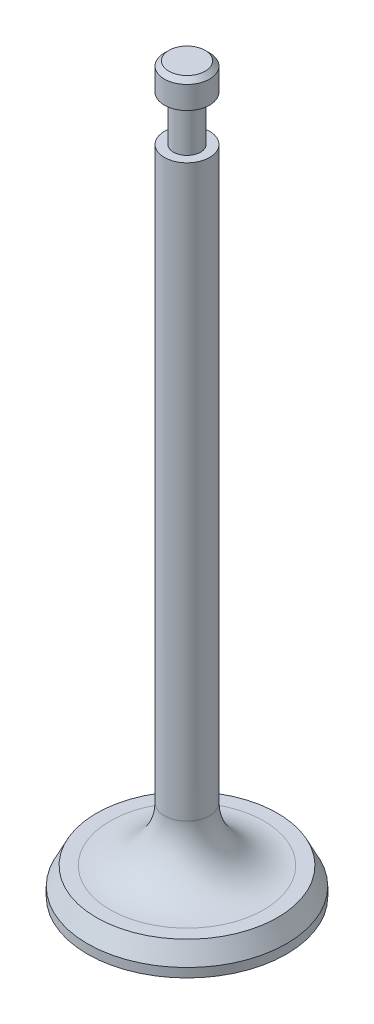
ISO-10303-21;
HEADER;
FILE_DESCRIPTION(('STEP AP214'),'2;1');
FILE_NAME('part.step','',(''),(''),'','','');
FILE_SCHEMA(('AUTOMOTIVE_DESIGN { 1 0 10303 214 1 1 1 1 }'));
ENDSEC;
DATA;
#1=APPLICATION_CONTEXT('core data for automotive mechanical design processes');
#2=APPLICATION_PROTOCOL_DEFINITION('international standard','automotive_design',2000,#1);
#3=PRODUCT_CONTEXT('',#1,'mechanical');
#4=PRODUCT('Part','Part','',(#3));
#5=PRODUCT_RELATED_PRODUCT_CATEGORY('part','',(#4));
#6=PRODUCT_DEFINITION_FORMATION('','',#4);
#7=PRODUCT_DEFINITION_CONTEXT('part definition',#1,'design');
#8=PRODUCT_DEFINITION('design','',#6,#7);
#9=PRODUCT_DEFINITION_SHAPE('','',#8);
#10=(LENGTH_UNIT() NAMED_UNIT(*) SI_UNIT(.MILLI.,.METRE.));
#11=(NAMED_UNIT(*) PLANE_ANGLE_UNIT() SI_UNIT($,.RADIAN.));
#12=(NAMED_UNIT(*) SI_UNIT($,.STERADIAN.) SOLID_ANGLE_UNIT());
#13=UNCERTAINTY_MEASURE_WITH_UNIT(LENGTH_MEASURE(1.E-05),#10,'distance_accuracy_value','');
#14=(GEOMETRIC_REPRESENTATION_CONTEXT(3) GLOBAL_UNCERTAINTY_ASSIGNED_CONTEXT((#13)) GLOBAL_UNIT_ASSIGNED_CONTEXT((#10,
#11,#12)) REPRESENTATION_CONTEXT('',''));
#15=CARTESIAN_POINT('',(0.,0.,0.));
#16=DIRECTION('',(0.,0.,1.));
#17=DIRECTION('',(1.,0.,0.));
#18=AXIS2_PLACEMENT_3D('',#15,#16,#17);
#19=CARTESIAN_POINT('',(0.,0.,-2.50000000000002));
#20=DIRECTION('',(0.,1.,0.));
#21=DIRECTION('',(0.,0.,1.));
#22=AXIS2_PLACEMENT_3D('',#19,#20,#21);
#23=PLANE('',#22);
#24=CARTESIAN_POINT('',(0.,0.,0.));
#25=DIRECTION('',(0.,1.,0.));
#26=DIRECTION('',(0.,0.,1.));
#27=AXIS2_PLACEMENT_3D('',#24,#25,#26);
#28=CIRCLE('',#27,2.00000000000002);
#29=CARTESIAN_POINT('',(0.,0.,2.00000000000002));
#30=VERTEX_POINT('',#29);
#31=EDGE_CURVE('E10',#30,#30,#28,.T.);
#32=ORIENTED_EDGE('',*,*,#31,.T.);
#33=EDGE_LOOP('',(#32));
#34=FACE_BOUND('',#33,.T.);
#35=ADVANCED_FACE('F44',(#34),#23,.T.);
#36=CARTESIAN_POINT('',(0.,-80.,0.));
#37=DIRECTION('',(0.,-1.,0.));
#38=DIRECTION('',(0.,0.,-1.));
#39=AXIS2_PLACEMENT_3D('',#36,#37,#38);
#40=PLANE('',#39);
#41=CARTESIAN_POINT('',(0.,-80.,0.));
#42=DIRECTION('',(0.,-1.,0.));
#43=DIRECTION('',(0.,0.,-1.));
#44=AXIS2_PLACEMENT_3D('',#41,#42,#43);
#45=CIRCLE('',#44,11.);
#46=CARTESIAN_POINT('',(0.,-80.,-11.));
#47=VERTEX_POINT('',#46);
#48=EDGE_CURVE('E81',#47,#47,#45,.T.);
#49=ORIENTED_EDGE('',*,*,#48,.T.);
#50=EDGE_LOOP('',(#49));
#51=FACE_BOUND('',#50,.T.);
#52=ADVANCED_FACE('F121',(#51),#40,.T.);
#53=CARTESIAN_POINT('',(0.,0.,0.));
#54=DIRECTION('',(0.,-1.,0.));
#55=DIRECTION('',(0.,0.,-1.));
#56=AXIS2_PLACEMENT_3D('',#53,#54,#55);
#57=CYLINDRICAL_SURFACE('',#56,11.);
#58=CARTESIAN_POINT('',(0.,-79.,0.));
#59=DIRECTION('',(0.,1.,0.));
#60=DIRECTION('',(0.,0.,1.));
#61=AXIS2_PLACEMENT_3D('',#58,#59,#60);
#62=CIRCLE('',#61,11.);
#63=CARTESIAN_POINT('',(0.,-79.,11.));
#64=VERTEX_POINT('',#63);
#65=EDGE_CURVE('E67',#64,#64,#62,.F.);
#66=ORIENTED_EDGE('',*,*,#65,.T.);
#67=EDGE_LOOP('',(#66));
#68=FACE_BOUND('',#67,.T.);
#69=ORIENTED_EDGE('',*,*,#48,.F.);
#70=EDGE_LOOP('',(#69));
#71=FACE_BOUND('',#70,.T.);
#72=ADVANCED_FACE('F126',(#68,#71),#57,.T.);
#73=CARTESIAN_POINT('',(0.,-77.,-11.));
#74=DIRECTION('',(0.,1.,0.));
#75=DIRECTION('',(0.,0.,1.));
#76=AXIS2_PLACEMENT_3D('',#73,#74,#75);
#77=PLANE('',#76);
#78=CARTESIAN_POINT('',(0.,-77.,0.));
#79=DIRECTION('',(0.,1.,0.));
#80=DIRECTION('',(0.,0.,1.));
#81=AXIS2_PLACEMENT_3D('',#78,#79,#80);
#82=CIRCLE('',#81,10.);
#83=CARTESIAN_POINT('',(0.,-77.,10.));
#84=VERTEX_POINT('',#83);
#85=EDGE_CURVE('E60',#84,#84,#82,.T.);
#86=ORIENTED_EDGE('',*,*,#85,.T.);
#87=EDGE_LOOP('',(#86));
#88=FACE_BOUND('',#87,.T.);
#89=CARTESIAN_POINT('',(0.,-77.,0.));
#90=DIRECTION('',(0.,1.,0.));
#91=DIRECTION('',(0.,0.,1.));
#92=AXIS2_PLACEMENT_3D('',#89,#90,#91);
#93=CIRCLE('',#92,8.50000000000001);
#94=CARTESIAN_POINT('',(0.,-77.,8.50000000000001));
#95=VERTEX_POINT('',#94);
#96=EDGE_CURVE('E77',#95,#95,#93,.F.);
#97=ORIENTED_EDGE('',*,*,#96,.T.);
#98=EDGE_LOOP('',(#97));
#99=FACE_BOUND('',#98,.T.);
#100=ADVANCED_FACE('F145',(#88,#99),#77,.T.);
#101=CARTESIAN_POINT('',(0.,0.,0.));
#102=DIRECTION('',(0.,-1.,0.));
#103=DIRECTION('',(0.,0.,-1.));
#104=AXIS2_PLACEMENT_3D('',#101,#102,#103);
#105=CYLINDRICAL_SURFACE('',#104,2.50000000000001);
#106=CARTESIAN_POINT('',(0.,-71.,0.));
#107=DIRECTION('',(0.,1.,0.));
#108=DIRECTION('',(0.,0.,1.));
#109=AXIS2_PLACEMENT_3D('',#106,#107,#108);
#110=CIRCLE('',#109,2.50000000000001);
#111=CARTESIAN_POINT('',(0.,-71.,2.50000000000001));
#112=VERTEX_POINT('',#111);
#113=EDGE_CURVE('E73',#112,#112,#110,.T.);
#114=ORIENTED_EDGE('',*,*,#113,.T.);
#115=EDGE_LOOP('',(#114));
#116=FACE_BOUND('',#115,.T.);
#117=CARTESIAN_POINT('',(0.,-8.,0.));
#118=DIRECTION('',(0.,-1.,0.));
#119=DIRECTION('',(0.,0.,-1.));
#120=AXIS2_PLACEMENT_3D('',#117,#118,#119);
#121=CIRCLE('',#120,2.50000000000001);
#122=CARTESIAN_POINT('',(0.,-8.,-2.50000000000001));
#123=VERTEX_POINT('',#122);
#124=EDGE_CURVE('E85',#123,#123,#121,.T.);
#125=ORIENTED_EDGE('',*,*,#124,.T.);
#126=EDGE_LOOP('',(#125));
#127=FACE_BOUND('',#126,.T.);
#128=ADVANCED_FACE('F150',(#116,#127),#105,.T.);
#129=CARTESIAN_POINT('',(0.,-8.,-2.50000000000001));
#130=DIRECTION('',(0.,1.,0.));
#131=DIRECTION('',(0.,0.,1.));
#132=AXIS2_PLACEMENT_3D('',#129,#130,#131);
#133=PLANE('',#132);
#134=CARTESIAN_POINT('',(0.,-8.,0.));
#135=DIRECTION('',(0.,-1.,0.));
#136=DIRECTION('',(0.,0.,-1.));
#137=AXIS2_PLACEMENT_3D('',#134,#135,#136);
#138=CIRCLE('',#137,1.50000000000002);
#139=CARTESIAN_POINT('',(0.,-8.,-1.50000000000002));
#140=VERTEX_POINT('',#139);
#141=EDGE_CURVE('E89',#140,#140,#138,.T.);
#142=ORIENTED_EDGE('',*,*,#141,.T.);
#143=EDGE_LOOP('',(#142));
#144=FACE_BOUND('',#143,.T.);
#145=ORIENTED_EDGE('',*,*,#124,.F.);
#146=EDGE_LOOP('',(#145));
#147=FACE_BOUND('',#146,.T.);
#148=ADVANCED_FACE('F156',(#144,#147),#133,.T.);
#149=CARTESIAN_POINT('',(0.,0.,0.));
#150=DIRECTION('',(0.,-1.,0.));
#151=DIRECTION('',(0.,0.,-1.));
#152=AXIS2_PLACEMENT_3D('',#149,#150,#151);
#153=CYLINDRICAL_SURFACE('',#152,1.50000000000002);
#154=CARTESIAN_POINT('',(0.,-3.,0.));
#155=DIRECTION('',(0.,-1.,0.));
#156=DIRECTION('',(0.,0.,-1.));
#157=AXIS2_PLACEMENT_3D('',#154,#155,#156);
#158=CIRCLE('',#157,1.50000000000002);
#159=CARTESIAN_POINT('',(0.,-3.,-1.50000000000002));
#160=VERTEX_POINT('',#159);
#161=EDGE_CURVE('E93',#160,#160,#158,.T.);
#162=ORIENTED_EDGE('',*,*,#161,.T.);
#163=EDGE_LOOP('',(#162));
#164=FACE_BOUND('',#163,.T.);
#165=ORIENTED_EDGE('',*,*,#141,.F.);
#166=EDGE_LOOP('',(#165));
#167=FACE_BOUND('',#166,.T.);
#168=ADVANCED_FACE('F118',(#164,#167),#153,.T.);
#169=CARTESIAN_POINT('',(0.,-3.,-1.50000000000002));
#170=DIRECTION('',(0.,-1.,0.));
#171=DIRECTION('',(0.,0.,-1.));
#172=AXIS2_PLACEMENT_3D('',#169,#170,#171);
#173=PLANE('',#172);
#174=CARTESIAN_POINT('',(0.,-3.,0.));
#175=DIRECTION('',(0.,-1.,0.));
#176=DIRECTION('',(0.,0.,-1.));
#177=AXIS2_PLACEMENT_3D('',#174,#175,#176);
#178=CIRCLE('',#177,2.50000000000002);
#179=CARTESIAN_POINT('',(0.,-3.,-2.50000000000002));
#180=VERTEX_POINT('',#179);
#181=EDGE_CURVE('E97',#180,#180,#178,.T.);
#182=ORIENTED_EDGE('',*,*,#181,.T.);
#183=EDGE_LOOP('',(#182));
#184=FACE_BOUND('',#183,.T.);
#185=ORIENTED_EDGE('',*,*,#161,.F.);
#186=EDGE_LOOP('',(#185));
#187=FACE_BOUND('',#186,.T.);
#188=ADVANCED_FACE('F104',(#184,#187),#173,.T.);
#189=CARTESIAN_POINT('',(0.,0.,0.));
#190=DIRECTION('',(0.,-1.,0.));
#191=DIRECTION('',(0.,0.,-1.));
#192=AXIS2_PLACEMENT_3D('',#189,#190,#191);
#193=CYLINDRICAL_SURFACE('',#192,2.50000000000002);
#194=CARTESIAN_POINT('',(0.,-0.500000000000001,0.));
#195=DIRECTION('',(0.,1.,0.));
#196=DIRECTION('',(0.,0.,1.));
#197=AXIS2_PLACEMENT_3D('',#194,#195,#196);
#198=CIRCLE('',#197,2.50000000000002);
#199=CARTESIAN_POINT('',(0.,-0.500000000000001,2.50000000000002));
#200=VERTEX_POINT('',#199);
#201=EDGE_CURVE('E53',#200,#200,#198,.F.);
#202=ORIENTED_EDGE('',*,*,#201,.T.);
#203=EDGE_LOOP('',(#202));
#204=FACE_BOUND('',#203,.T.);
#205=ORIENTED_EDGE('',*,*,#181,.F.);
#206=EDGE_LOOP('',(#205));
#207=FACE_BOUND('',#206,.T.);
#208=ADVANCED_FACE('F107',(#204,#207),#193,.T.);
#209=CARTESIAN_POINT('',(0.,-71.,0.));
#210=DIRECTION('',(0.,1.,0.));
#211=DIRECTION('',(0.,0.,1.));
#212=AXIS2_PLACEMENT_3D('',#209,#210,#211);
#213=TOROIDAL_SURFACE('',#212,8.50000000000001,6.);
#214=ORIENTED_EDGE('',*,*,#113,.F.);
#215=EDGE_LOOP('',(#214));
#216=FACE_BOUND('',#215,.T.);
#217=ORIENTED_EDGE('',*,*,#96,.F.);
#218=EDGE_LOOP('',(#217));
#219=FACE_BOUND('',#218,.T.);
#220=ADVANCED_FACE('F109',(#216,#219),#213,.F.);
#221=CARTESIAN_POINT('',(0.,-79.,0.));
#222=DIRECTION('',(0.,-1.,0.));
#223=DIRECTION('',(0.,0.,-1.));
#224=AXIS2_PLACEMENT_3D('',#221,#222,#223);
#225=CONICAL_SURFACE('',#224,11.,0.463647609000803);
#226=ORIENTED_EDGE('',*,*,#85,.F.);
#227=EDGE_LOOP('',(#226));
#228=FACE_BOUND('',#227,.T.);
#229=ORIENTED_EDGE('',*,*,#65,.F.);
#230=EDGE_LOOP('',(#229));
#231=FACE_BOUND('',#230,.T.);
#232=ADVANCED_FACE('F115',(#228,#231),#225,.T.);
#233=CARTESIAN_POINT('',(0.,-0.500000000000001,0.));
#234=DIRECTION('',(0.,-1.,0.));
#235=DIRECTION('',(0.,0.,-1.));
#236=AXIS2_PLACEMENT_3D('',#233,#234,#235);
#237=CONICAL_SURFACE('',#236,2.50000000000002,0.78539816339745);
#238=ORIENTED_EDGE('',*,*,#31,.F.);
#239=EDGE_LOOP('',(#238));
#240=FACE_BOUND('',#239,.T.);
#241=ORIENTED_EDGE('',*,*,#201,.F.);
#242=EDGE_LOOP('',(#241));
#243=FACE_BOUND('',#242,.T.);
#244=ADVANCED_FACE('F47',(#240,#243),#237,.T.);
#245=CLOSED_SHELL('',(#35,#52,#72,#100,#128,#148,#168,#188,#208,#220,#232,#244));
#246=MANIFOLD_SOLID_BREP('B2',#245);
#247=ADVANCED_BREP_SHAPE_REPRESENTATION('',(#18,#246),#14);
#248=SHAPE_DEFINITION_REPRESENTATION(#9,#247);
ENDSEC;
END-ISO-10303-21;
